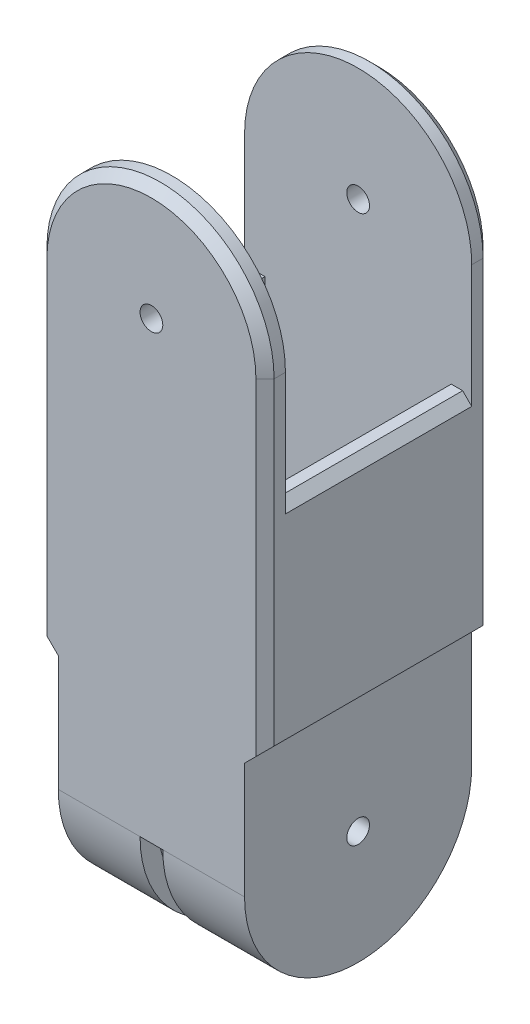
ISO-10303-21;
HEADER;
FILE_DESCRIPTION(('STEP AP214'),'2;1');
FILE_NAME('part.step','',(''),(''),'','','');
FILE_SCHEMA(('AUTOMOTIVE_DESIGN { 1 0 10303 214 1 1 1 1 }'));
ENDSEC;
DATA;
#1=APPLICATION_CONTEXT('core data for automotive mechanical design processes');
#2=APPLICATION_PROTOCOL_DEFINITION('international standard','automotive_design',2000,#1);
#3=PRODUCT_CONTEXT('',#1,'mechanical');
#4=PRODUCT('Part','Part','',(#3));
#5=PRODUCT_RELATED_PRODUCT_CATEGORY('part','',(#4));
#6=PRODUCT_DEFINITION_FORMATION('','',#4);
#7=PRODUCT_DEFINITION_CONTEXT('part definition',#1,'design');
#8=PRODUCT_DEFINITION('design','',#6,#7);
#9=PRODUCT_DEFINITION_SHAPE('','',#8);
#10=(LENGTH_UNIT() NAMED_UNIT(*) SI_UNIT(.MILLI.,.METRE.));
#11=(NAMED_UNIT(*) PLANE_ANGLE_UNIT() SI_UNIT($,.RADIAN.));
#12=(NAMED_UNIT(*) SI_UNIT($,.STERADIAN.) SOLID_ANGLE_UNIT());
#13=UNCERTAINTY_MEASURE_WITH_UNIT(LENGTH_MEASURE(1.E-05),#10,'distance_accuracy_value','');
#14=(GEOMETRIC_REPRESENTATION_CONTEXT(3) GLOBAL_UNCERTAINTY_ASSIGNED_CONTEXT((#13)) GLOBAL_UNIT_ASSIGNED_CONTEXT((#10,
#11,#12)) REPRESENTATION_CONTEXT('',''));
#15=CARTESIAN_POINT('',(0.,0.,0.));
#16=DIRECTION('',(0.,0.,1.));
#17=DIRECTION('',(1.,0.,0.));
#18=AXIS2_PLACEMENT_3D('',#15,#16,#17);
#19=CARTESIAN_POINT('',(-25.,25.,0.));
#20=DIRECTION('',(1.,0.,0.));
#21=DIRECTION('',(0.,0.,-1.));
#22=AXIS2_PLACEMENT_3D('',#19,#20,#21);
#23=CYLINDRICAL_SURFACE('',#22,25.);
#24=CARTESIAN_POINT('',(-2.5,25.,0.));
#25=DIRECTION('',(1.,0.,0.));
#26=DIRECTION('',(0.,0.,-1.));
#27=AXIS2_PLACEMENT_3D('',#24,#25,#26);
#28=CIRCLE('',#27,25.);
#29=CARTESIAN_POINT('',(-2.5,25.,25.));
#30=VERTEX_POINT('',#29);
#31=CARTESIAN_POINT('',(-2.5,25.,-25.));
#32=VERTEX_POINT('',#31);
#33=EDGE_CURVE('E730',#30,#32,#28,.T.);
#34=ORIENTED_EDGE('',*,*,#33,.F.);
#35=DIRECTION('',(1.,0.,0.));
#36=VECTOR('',#35,1.);
#37=CARTESIAN_POINT('',(-25.,25.,25.));
#38=LINE('',#37,#36);
#39=CARTESIAN_POINT('',(-20.5,25.,25.));
#40=VERTEX_POINT('',#39);
#41=EDGE_CURVE('E433',#40,#30,#38,.T.);
#42=ORIENTED_EDGE('',*,*,#41,.F.);
#43=CARTESIAN_POINT('',(-20.5,25.,0.));
#44=DIRECTION('',(1.,0.,0.));
#45=DIRECTION('',(0.,0.,-1.));
#46=AXIS2_PLACEMENT_3D('',#43,#44,#45);
#47=CIRCLE('',#46,25.);
#48=CARTESIAN_POINT('',(-20.5,25.,-25.));
#49=VERTEX_POINT('',#48);
#50=EDGE_CURVE('E412',#40,#49,#47,.T.);
#51=ORIENTED_EDGE('',*,*,#50,.T.);
#52=DIRECTION('',(1.,0.,0.));
#53=VECTOR('',#52,1.);
#54=CARTESIAN_POINT('',(-25.,25.,-25.));
#55=LINE('',#54,#53);
#56=EDGE_CURVE('E428',#49,#32,#55,.T.);
#57=ORIENTED_EDGE('',*,*,#56,.T.);
#58=EDGE_LOOP('',(#34,#42,#51,#57));
#59=FACE_BOUND('',#58,.T.);
#60=ADVANCED_FACE('F88',(#59),#23,.T.);
#61=CARTESIAN_POINT('',(2.5,25.,0.));
#62=DIRECTION('',(-1.,0.,0.));
#63=DIRECTION('',(0.,0.,1.));
#64=AXIS2_PLACEMENT_3D('',#61,#62,#63);
#65=CIRCLE('',#64,25.);
#66=CARTESIAN_POINT('',(2.5,25.,-25.));
#67=VERTEX_POINT('',#66);
#68=CARTESIAN_POINT('',(2.5,25.,25.));
#69=VERTEX_POINT('',#68);
#70=EDGE_CURVE('E105',#67,#69,#65,.T.);
#71=ORIENTED_EDGE('',*,*,#70,.F.);
#72=CARTESIAN_POINT('',(20.5,25.,-25.));
#73=VERTEX_POINT('',#72);
#74=EDGE_CURVE('E427',#67,#73,#55,.T.);
#75=ORIENTED_EDGE('',*,*,#74,.T.);
#76=CARTESIAN_POINT('',(20.5,25.,0.));
#77=DIRECTION('',(-1.,0.,0.));
#78=DIRECTION('',(0.,0.,1.));
#79=AXIS2_PLACEMENT_3D('',#76,#77,#78);
#80=CIRCLE('',#79,25.);
#81=CARTESIAN_POINT('',(20.5,25.,25.));
#82=VERTEX_POINT('',#81);
#83=EDGE_CURVE('E423',#73,#82,#80,.T.);
#84=ORIENTED_EDGE('',*,*,#83,.T.);
#85=EDGE_CURVE('E432',#69,#82,#38,.T.);
#86=ORIENTED_EDGE('',*,*,#85,.F.);
#87=EDGE_LOOP('',(#71,#75,#84,#86));
#88=FACE_BOUND('',#87,.T.);
#89=ADVANCED_FACE('F812',(#88),#23,.T.);
#90=CARTESIAN_POINT('',(-63.9574275274956,25.,0.));
#91=DIRECTION('',(1.,0.,0.));
#92=DIRECTION('',(0.,0.,-1.));
#93=AXIS2_PLACEMENT_3D('',#90,#91,#92);
#94=CYLINDRICAL_SURFACE('',#93,21.);
#95=DIRECTION('',(1.,0.,0.));
#96=VECTOR('',#95,1.);
#97=CARTESIAN_POINT('',(-63.9574275274956,25.,21.));
#98=LINE('',#97,#96);
#99=CARTESIAN_POINT('',(-17.,25.,21.));
#100=VERTEX_POINT('',#99);
#101=CARTESIAN_POINT('',(-2.5,25.,21.));
#102=VERTEX_POINT('',#101);
#103=EDGE_CURVE('E321',#100,#102,#98,.T.);
#104=ORIENTED_EDGE('',*,*,#103,.T.);
#105=CARTESIAN_POINT('',(-2.5,25.,0.));
#106=DIRECTION('',(1.,0.,0.));
#107=DIRECTION('',(0.,0.,-1.));
#108=AXIS2_PLACEMENT_3D('',#105,#106,#107);
#109=CIRCLE('',#108,21.);
#110=CARTESIAN_POINT('',(-2.5,25.,-21.));
#111=VERTEX_POINT('',#110);
#112=EDGE_CURVE('E733',#102,#111,#109,.T.);
#113=ORIENTED_EDGE('',*,*,#112,.T.);
#114=DIRECTION('',(1.,0.,0.));
#115=VECTOR('',#114,1.);
#116=CARTESIAN_POINT('',(-63.9574275274956,25.,-21.));
#117=LINE('',#116,#115);
#118=CARTESIAN_POINT('',(-17.,25.,-21.));
#119=VERTEX_POINT('',#118);
#120=EDGE_CURVE('E328',#119,#111,#117,.T.);
#121=ORIENTED_EDGE('',*,*,#120,.F.);
#122=CARTESIAN_POINT('',(-17.,25.,0.));
#123=DIRECTION('',(-1.,0.,0.));
#124=DIRECTION('',(0.,0.,1.));
#125=AXIS2_PLACEMENT_3D('',#122,#123,#124);
#126=CIRCLE('',#125,21.);
#127=EDGE_CURVE('E349',#119,#100,#126,.T.);
#128=ORIENTED_EDGE('',*,*,#127,.T.);
#129=EDGE_LOOP('',(#104,#113,#121,#128));
#130=FACE_BOUND('',#129,.T.);
#131=ADVANCED_FACE('F750',(#130),#94,.F.);
#132=CARTESIAN_POINT('',(2.5,25.,-21.));
#133=VERTEX_POINT('',#132);
#134=CARTESIAN_POINT('',(17.,25.,-21.));
#135=VERTEX_POINT('',#134);
#136=EDGE_CURVE('E313',#133,#135,#117,.T.);
#137=ORIENTED_EDGE('',*,*,#136,.F.);
#138=CARTESIAN_POINT('',(2.5,25.,0.));
#139=DIRECTION('',(-1.,0.,0.));
#140=DIRECTION('',(0.,0.,1.));
#141=AXIS2_PLACEMENT_3D('',#138,#139,#140);
#142=CIRCLE('',#141,21.);
#143=CARTESIAN_POINT('',(2.5,25.,21.));
#144=VERTEX_POINT('',#143);
#145=EDGE_CURVE('E300',#133,#144,#142,.T.);
#146=ORIENTED_EDGE('',*,*,#145,.T.);
#147=CARTESIAN_POINT('',(17.,25.,21.));
#148=VERTEX_POINT('',#147);
#149=EDGE_CURVE('E311',#144,#148,#98,.T.);
#150=ORIENTED_EDGE('',*,*,#149,.T.);
#151=CARTESIAN_POINT('',(17.,25.,0.));
#152=DIRECTION('',(-1.,0.,0.));
#153=DIRECTION('',(0.,0.,-1.));
#154=AXIS2_PLACEMENT_3D('',#151,#152,#153);
#155=CIRCLE('',#154,21.);
#156=EDGE_CURVE('E322',#135,#148,#155,.T.);
#157=ORIENTED_EDGE('',*,*,#156,.F.);
#158=EDGE_LOOP('',(#137,#146,#150,#157));
#159=FACE_BOUND('',#158,.T.);
#160=ADVANCED_FACE('F309',(#159),#94,.F.);
#161=CARTESIAN_POINT('',(-25.,25.,0.));
#162=DIRECTION('',(1.,0.,0.));
#163=DIRECTION('',(0.,0.,-1.));
#164=AXIS2_PLACEMENT_3D('',#161,#162,#163);
#165=CYLINDRICAL_SURFACE('',#164,2.5);
#166=CARTESIAN_POINT('',(17.,25.,0.));
#167=DIRECTION('',(1.,0.,0.));
#168=DIRECTION('',(0.,0.,-1.));
#169=AXIS2_PLACEMENT_3D('',#166,#167,#168);
#170=CIRCLE('',#169,2.5);
#171=CARTESIAN_POINT('',(17.,25.,-2.5));
#172=VERTEX_POINT('',#171);
#173=EDGE_CURVE('E12',#172,#172,#170,.T.);
#174=ORIENTED_EDGE('',*,*,#173,.F.);
#175=EDGE_LOOP('',(#174));
#176=FACE_BOUND('',#175,.T.);
#177=CARTESIAN_POINT('',(20.5,25.,0.));
#178=DIRECTION('',(-1.,0.,0.));
#179=DIRECTION('',(0.,0.,1.));
#180=AXIS2_PLACEMENT_3D('',#177,#178,#179);
#181=CIRCLE('',#180,2.5);
#182=CARTESIAN_POINT('',(20.5,25.,2.5));
#183=VERTEX_POINT('',#182);
#184=EDGE_CURVE('E422',#183,#183,#181,.T.);
#185=ORIENTED_EDGE('',*,*,#184,.F.);
#186=EDGE_LOOP('',(#185));
#187=FACE_BOUND('',#186,.T.);
#188=ADVANCED_FACE('F644',(#176,#187),#165,.F.);
#189=CARTESIAN_POINT('',(0.,55.0000000000001,0.));
#190=DIRECTION('',(0.,-1.,0.));
#191=DIRECTION('',(0.,0.,-1.));
#192=AXIS2_PLACEMENT_3D('',#189,#190,#191);
#193=PLANE('',#192);
#194=DIRECTION('',(0.,0.,-1.));
#195=VECTOR('',#194,1.);
#196=CARTESIAN_POINT('',(17.,55.0000000000001,20.5));
#197=LINE('',#196,#195);
#198=CARTESIAN_POINT('',(17.,55.0000000000001,20.5));
#199=VERTEX_POINT('',#198);
#200=CARTESIAN_POINT('',(17.,55.0000000000001,-20.5));
#201=VERTEX_POINT('',#200);
#202=EDGE_CURVE('E345',#199,#201,#197,.T.);
#203=ORIENTED_EDGE('',*,*,#202,.F.);
#204=DIRECTION('',(1.,0.,0.));
#205=VECTOR('',#204,1.);
#206=CARTESIAN_POINT('',(-20.5,55.0000000000001,20.5));
#207=LINE('',#206,#205);
#208=CARTESIAN_POINT('',(20.5,55.0000000000001,20.5));
#209=VERTEX_POINT('',#208);
#210=EDGE_CURVE('E379',#199,#209,#207,.T.);
#211=ORIENTED_EDGE('',*,*,#210,.T.);
#212=DIRECTION('',(0.,0.,-1.));
#213=VECTOR('',#212,1.);
#214=CARTESIAN_POINT('',(20.5,55.0000000000001,20.5));
#215=LINE('',#214,#213);
#216=CARTESIAN_POINT('',(20.5,55.0000000000001,-20.5));
#217=VERTEX_POINT('',#216);
#218=EDGE_CURVE('E365',#209,#217,#215,.T.);
#219=ORIENTED_EDGE('',*,*,#218,.T.);
#220=DIRECTION('',(-1.,0.,0.));
#221=VECTOR('',#220,1.);
#222=CARTESIAN_POINT('',(-20.5,55.0000000000001,-20.5));
#223=LINE('',#222,#221);
#224=EDGE_CURVE('E371',#217,#201,#223,.T.);
#225=ORIENTED_EDGE('',*,*,#224,.T.);
#226=EDGE_LOOP('',(#203,#211,#219,#225));
#227=FACE_BOUND('',#226,.T.);
#228=ADVANCED_FACE('F779',(#227),#193,.F.);
#229=DIRECTION('',(0.,0.,1.));
#230=VECTOR('',#229,1.);
#231=CARTESIAN_POINT('',(-17.,55.0000000000001,20.5));
#232=LINE('',#231,#230);
#233=CARTESIAN_POINT('',(-17.,55.0000000000001,-20.5));
#234=VERTEX_POINT('',#233);
#235=CARTESIAN_POINT('',(-17.,55.0000000000001,20.5));
#236=VERTEX_POINT('',#235);
#237=EDGE_CURVE('E341',#234,#236,#232,.T.);
#238=ORIENTED_EDGE('',*,*,#237,.F.);
#239=CARTESIAN_POINT('',(-20.5,55.0000000000001,-20.5));
#240=VERTEX_POINT('',#239);
#241=EDGE_CURVE('E369',#234,#240,#223,.T.);
#242=ORIENTED_EDGE('',*,*,#241,.T.);
#243=DIRECTION('',(0.,0.,1.));
#244=VECTOR('',#243,1.);
#245=CARTESIAN_POINT('',(-20.5,55.0000000000001,20.5));
#246=LINE('',#245,#244);
#247=CARTESIAN_POINT('',(-20.5,55.0000000000001,20.5));
#248=VERTEX_POINT('',#247);
#249=EDGE_CURVE('E375',#240,#248,#246,.T.);
#250=ORIENTED_EDGE('',*,*,#249,.T.);
#251=EDGE_CURVE('E380',#248,#236,#207,.T.);
#252=ORIENTED_EDGE('',*,*,#251,.T.);
#253=EDGE_LOOP('',(#238,#242,#250,#252));
#254=FACE_BOUND('',#253,.T.);
#255=ADVANCED_FACE('F766',(#254),#193,.F.);
#256=CARTESIAN_POINT('',(0.,100.,0.));
#257=DIRECTION('',(0.,-1.,0.));
#258=DIRECTION('',(0.,0.,-1.));
#259=AXIS2_PLACEMENT_3D('',#256,#257,#258);
#260=PLANE('',#259);
#261=DIRECTION('',(-1.,0.,0.));
#262=VECTOR('',#261,1.);
#263=CARTESIAN_POINT('',(25.,100.,-20.5));
#264=LINE('',#263,#262);
#265=CARTESIAN_POINT('',(23.,100.,-20.5));
#266=VERTEX_POINT('',#265);
#267=CARTESIAN_POINT('',(20.5,100.,-20.5));
#268=VERTEX_POINT('',#267);
#269=EDGE_CURVE('E479',#266,#268,#264,.T.);
#270=ORIENTED_EDGE('',*,*,#269,.T.);
#271=DIRECTION('',(0.,0.,-1.));
#272=VECTOR('',#271,1.);
#273=CARTESIAN_POINT('',(20.5,100.,20.5));
#274=LINE('',#273,#272);
#275=CARTESIAN_POINT('',(20.5,100.,20.5));
#276=VERTEX_POINT('',#275);
#277=EDGE_CURVE('E356',#276,#268,#274,.T.);
#278=ORIENTED_EDGE('',*,*,#277,.F.);
#279=DIRECTION('',(-1.,0.,0.));
#280=VECTOR('',#279,1.);
#281=CARTESIAN_POINT('',(25.,100.,20.5));
#282=LINE('',#281,#280);
#283=CARTESIAN_POINT('',(23.,100.,20.5));
#284=VERTEX_POINT('',#283);
#285=EDGE_CURVE('E455',#284,#276,#282,.T.);
#286=ORIENTED_EDGE('',*,*,#285,.F.);
#287=DIRECTION('',(0.,0.,-1.));
#288=VECTOR('',#287,1.);
#289=CARTESIAN_POINT('',(23.,100.,0.));
#290=LINE('',#289,#288);
#291=EDGE_CURVE('E509',#284,#266,#290,.T.);
#292=ORIENTED_EDGE('',*,*,#291,.T.);
#293=EDGE_LOOP('',(#270,#278,#286,#292));
#294=FACE_BOUND('',#293,.T.);
#295=ADVANCED_FACE('F790',(#294),#260,.F.);
#296=CARTESIAN_POINT('',(-25.,100.,25.));
#297=DIRECTION('',(1.,0.,0.));
#298=DIRECTION('',(0.,0.,-1.));
#299=AXIS2_PLACEMENT_3D('',#296,#297,#298);
#300=PLANE('',#299);
#301=DIRECTION('',(0.,-1.,0.));
#302=VECTOR('',#301,1.);
#303=CARTESIAN_POINT('',(-25.,100.,-23.));
#304=LINE('',#303,#302);
#305=CARTESIAN_POINT('',(-25.,125.,-23.));
#306=VERTEX_POINT('',#305);
#307=CARTESIAN_POINT('',(-25.,55.0000000000001,-23.));
#308=VERTEX_POINT('',#307);
#309=EDGE_CURVE('E527',#306,#308,#304,.T.);
#310=ORIENTED_EDGE('',*,*,#309,.T.);
#311=DIRECTION('',(0.,0.,1.));
#312=VECTOR('',#311,1.);
#313=CARTESIAN_POINT('',(-25.,55.0000000000001,23.));
#314=LINE('',#313,#312);
#315=CARTESIAN_POINT('',(-25.,55.0000000000001,23.));
#316=VERTEX_POINT('',#315);
#317=EDGE_CURVE('E614',#308,#316,#314,.T.);
#318=ORIENTED_EDGE('',*,*,#317,.T.);
#319=DIRECTION('',(0.,1.,0.));
#320=VECTOR('',#319,1.);
#321=CARTESIAN_POINT('',(-25.,100.,23.));
#322=LINE('',#321,#320);
#323=CARTESIAN_POINT('',(-25.,125.,23.));
#324=VERTEX_POINT('',#323);
#325=EDGE_CURVE('E524',#316,#324,#322,.T.);
#326=ORIENTED_EDGE('',*,*,#325,.T.);
#327=DIRECTION('',(0.,0.,1.));
#328=VECTOR('',#327,1.);
#329=CARTESIAN_POINT('',(-25.,125.,20.5));
#330=LINE('',#329,#328);
#331=CARTESIAN_POINT('',(-25.,125.,20.5));
#332=VERTEX_POINT('',#331);
#333=EDGE_CURVE('E460',#332,#324,#330,.T.);
#334=ORIENTED_EDGE('',*,*,#333,.F.);
#335=DIRECTION('',(0.,1.,0.));
#336=VECTOR('',#335,1.);
#337=CARTESIAN_POINT('',(-25.,100.,20.5));
#338=LINE('',#337,#336);
#339=CARTESIAN_POINT('',(-25.,98.,20.5));
#340=VERTEX_POINT('',#339);
#341=EDGE_CURVE('E451',#340,#332,#338,.T.);
#342=ORIENTED_EDGE('',*,*,#341,.F.);
#343=DIRECTION('',(0.,0.,-1.));
#344=VECTOR('',#343,1.);
#345=CARTESIAN_POINT('',(-25.,98.,25.));
#346=LINE('',#345,#344);
#347=CARTESIAN_POINT('',(-25.,98.,-20.5));
#348=VERTEX_POINT('',#347);
#349=EDGE_CURVE('E531',#340,#348,#346,.T.);
#350=ORIENTED_EDGE('',*,*,#349,.T.);
#351=DIRECTION('',(0.,1.,0.));
#352=VECTOR('',#351,1.);
#353=CARTESIAN_POINT('',(-25.,100.,-20.5));
#354=LINE('',#353,#352);
#355=CARTESIAN_POINT('',(-25.,125.,-20.5));
#356=VERTEX_POINT('',#355);
#357=EDGE_CURVE('E483',#348,#356,#354,.T.);
#358=ORIENTED_EDGE('',*,*,#357,.T.);
#359=DIRECTION('',(0.,0.,-1.));
#360=VECTOR('',#359,1.);
#361=CARTESIAN_POINT('',(-25.,125.,-20.5));
#362=LINE('',#361,#360);
#363=EDGE_CURVE('E491',#356,#306,#362,.T.);
#364=ORIENTED_EDGE('',*,*,#363,.T.);
#365=EDGE_LOOP('',(#310,#318,#326,#334,#342,#350,#358,#364));
#366=FACE_BOUND('',#365,.T.);
#367=ADVANCED_FACE('F798',(#366),#300,.F.);
#368=CARTESIAN_POINT('',(-25.,100.,25.));
#369=DIRECTION('',(0.,0.,-1.));
#370=DIRECTION('',(-1.,0.,0.));
#371=AXIS2_PLACEMENT_3D('',#368,#369,#370);
#372=PLANE('',#371);
#373=CARTESIAN_POINT('',(0.,125.,25.));
#374=DIRECTION('',(0.,0.,-1.));
#375=DIRECTION('',(-1.,0.,0.));
#376=AXIS2_PLACEMENT_3D('',#373,#374,#375);
#377=CIRCLE('',#376,2.5);
#378=CARTESIAN_POINT('',(-2.5,125.,25.));
#379=VERTEX_POINT('',#378);
#380=EDGE_CURVE('E437',#379,#379,#377,.T.);
#381=ORIENTED_EDGE('',*,*,#380,.T.);
#382=EDGE_LOOP('',(#381));
#383=FACE_BOUND('',#382,.T.);
#384=DIRECTION('',(0.,-1.,0.));
#385=VECTOR('',#384,1.);
#386=CARTESIAN_POINT('',(20.5,0.,25.));
#387=LINE('',#386,#385);
#388=CARTESIAN_POINT('',(20.5,50.5000000000001,25.));
#389=VERTEX_POINT('',#388);
#390=EDGE_CURVE('E415',#389,#82,#387,.T.);
#391=ORIENTED_EDGE('',*,*,#390,.F.);
#392=DIRECTION('',(-0.707106781186551,-0.707106781186544,0.));
#393=VECTOR('',#392,1.);
#394=CARTESIAN_POINT('',(19.9999999999999,50.,25.));
#395=LINE('',#394,#393);
#396=CARTESIAN_POINT('',(23.,53.0000000000001,25.));
#397=VERTEX_POINT('',#396);
#398=EDGE_CURVE('E594',#389,#397,#395,.F.);
#399=ORIENTED_EDGE('',*,*,#398,.T.);
#400=DIRECTION('',(0.,1.,0.));
#401=VECTOR('',#400,1.);
#402=CARTESIAN_POINT('',(23.,100.,25.));
#403=LINE('',#402,#401);
#404=CARTESIAN_POINT('',(23.,125.,25.));
#405=VERTEX_POINT('',#404);
#406=EDGE_CURVE('E551',#397,#405,#403,.T.);
#407=ORIENTED_EDGE('',*,*,#406,.T.);
#408=CARTESIAN_POINT('',(0.,125.,25.));
#409=DIRECTION('',(0.,0.,-1.));
#410=DIRECTION('',(-1.,0.,0.));
#411=AXIS2_PLACEMENT_3D('',#408,#409,#410);
#412=CIRCLE('',#411,23.);
#413=CARTESIAN_POINT('',(-23.,125.,25.));
#414=VERTEX_POINT('',#413);
#415=EDGE_CURVE('E548',#405,#414,#412,.F.);
#416=ORIENTED_EDGE('',*,*,#415,.T.);
#417=DIRECTION('',(0.,-1.,0.));
#418=VECTOR('',#417,1.);
#419=CARTESIAN_POINT('',(-23.,100.,25.));
#420=LINE('',#419,#418);
#421=CARTESIAN_POINT('',(-23.,53.0000000000001,25.));
#422=VERTEX_POINT('',#421);
#423=EDGE_CURVE('E554',#414,#422,#420,.T.);
#424=ORIENTED_EDGE('',*,*,#423,.T.);
#425=DIRECTION('',(0.707106781186544,-0.707106781186551,0.));
#426=VECTOR('',#425,1.);
#427=CARTESIAN_POINT('',(-25.,55.0000000000001,25.));
#428=LINE('',#427,#426);
#429=CARTESIAN_POINT('',(-20.5,50.5000000000001,25.));
#430=VERTEX_POINT('',#429);
#431=EDGE_CURVE('E576',#422,#430,#428,.T.);
#432=ORIENTED_EDGE('',*,*,#431,.T.);
#433=DIRECTION('',(0.,-1.,0.));
#434=VECTOR('',#433,1.);
#435=CARTESIAN_POINT('',(-20.5,0.,25.));
#436=LINE('',#435,#434);
#437=EDGE_CURVE('E403',#430,#40,#436,.T.);
#438=ORIENTED_EDGE('',*,*,#437,.T.);
#439=ORIENTED_EDGE('',*,*,#41,.T.);
#440=DIRECTION('',(1.,0.,0.));
#441=VECTOR('',#440,1.);
#442=CARTESIAN_POINT('',(-25.,25.,25.));
#443=LINE('',#442,#441);
#444=EDGE_CURVE('E727',#69,#30,#443,.F.);
#445=ORIENTED_EDGE('',*,*,#444,.F.);
#446=ORIENTED_EDGE('',*,*,#85,.T.);
#447=EDGE_LOOP('',(#391,#399,#407,#416,#424,#432,#438,#439,#445,#446));
#448=FACE_BOUND('',#447,.T.);
#449=ADVANCED_FACE('F658',(#383,#448),#372,.F.);
#450=CARTESIAN_POINT('',(-25.,100.,-25.));
#451=DIRECTION('',(0.,0.,1.));
#452=DIRECTION('',(1.,0.,0.));
#453=AXIS2_PLACEMENT_3D('',#450,#451,#452);
#454=PLANE('',#453);
#455=DIRECTION('',(0.707106781186551,0.707106781186544,0.));
#456=VECTOR('',#455,1.);
#457=CARTESIAN_POINT('',(19.9999999999999,50.,-25.));
#458=LINE('',#457,#456);
#459=CARTESIAN_POINT('',(23.,53.0000000000001,-25.));
#460=VERTEX_POINT('',#459);
#461=CARTESIAN_POINT('',(20.5,50.5000000000001,-25.));
#462=VERTEX_POINT('',#461);
#463=EDGE_CURVE('E607',#460,#462,#458,.F.);
#464=ORIENTED_EDGE('',*,*,#463,.T.);
#465=DIRECTION('',(0.,1.,0.));
#466=VECTOR('',#465,1.);
#467=CARTESIAN_POINT('',(20.5,50.,-25.));
#468=LINE('',#467,#466);
#469=EDGE_CURVE('E419',#73,#462,#468,.T.);
#470=ORIENTED_EDGE('',*,*,#469,.F.);
#471=ORIENTED_EDGE('',*,*,#74,.F.);
#472=DIRECTION('',(1.,0.,0.));
#473=VECTOR('',#472,1.);
#474=CARTESIAN_POINT('',(-25.,25.,-25.));
#475=LINE('',#474,#473);
#476=EDGE_CURVE('E707',#32,#67,#475,.T.);
#477=ORIENTED_EDGE('',*,*,#476,.F.);
#478=ORIENTED_EDGE('',*,*,#56,.F.);
#479=DIRECTION('',(0.,1.,0.));
#480=VECTOR('',#479,1.);
#481=CARTESIAN_POINT('',(-20.5,50.,-25.));
#482=LINE('',#481,#480);
#483=CARTESIAN_POINT('',(-20.5,50.5000000000001,-25.));
#484=VERTEX_POINT('',#483);
#485=EDGE_CURVE('E407',#49,#484,#482,.T.);
#486=ORIENTED_EDGE('',*,*,#485,.T.);
#487=DIRECTION('',(-0.707106781186544,0.707106781186551,0.));
#488=VECTOR('',#487,1.);
#489=CARTESIAN_POINT('',(-25.,55.0000000000001,-25.));
#490=LINE('',#489,#488);
#491=CARTESIAN_POINT('',(-23.,53.0000000000001,-25.));
#492=VERTEX_POINT('',#491);
#493=EDGE_CURVE('E604',#484,#492,#490,.T.);
#494=ORIENTED_EDGE('',*,*,#493,.T.);
#495=DIRECTION('',(0.,1.,0.));
#496=VECTOR('',#495,1.);
#497=CARTESIAN_POINT('',(-23.,100.,-25.));
#498=LINE('',#497,#496);
#499=CARTESIAN_POINT('',(-23.,125.,-25.));
#500=VERTEX_POINT('',#499);
#501=EDGE_CURVE('E542',#492,#500,#498,.T.);
#502=ORIENTED_EDGE('',*,*,#501,.T.);
#503=CARTESIAN_POINT('',(0.,125.,-25.));
#504=DIRECTION('',(0.,0.,1.));
#505=DIRECTION('',(1.,0.,0.));
#506=AXIS2_PLACEMENT_3D('',#503,#504,#505);
#507=CIRCLE('',#506,23.);
#508=CARTESIAN_POINT('',(23.,125.,-25.));
#509=VERTEX_POINT('',#508);
#510=EDGE_CURVE('E535',#500,#509,#507,.F.);
#511=ORIENTED_EDGE('',*,*,#510,.T.);
#512=DIRECTION('',(0.,-1.,0.));
#513=VECTOR('',#512,1.);
#514=CARTESIAN_POINT('',(23.,100.,-25.));
#515=LINE('',#514,#513);
#516=EDGE_CURVE('E538',#509,#460,#515,.T.);
#517=ORIENTED_EDGE('',*,*,#516,.T.);
#518=EDGE_LOOP('',(#464,#470,#471,#477,#478,#486,#494,#502,#511,#517));
#519=FACE_BOUND('',#518,.T.);
#520=CARTESIAN_POINT('',(0.,125.,-25.));
#521=DIRECTION('',(0.,0.,-1.));
#522=DIRECTION('',(-1.,0.,0.));
#523=AXIS2_PLACEMENT_3D('',#520,#521,#522);
#524=CIRCLE('',#523,2.5);
#525=CARTESIAN_POINT('',(-2.5,125.,-25.));
#526=VERTEX_POINT('',#525);
#527=EDGE_CURVE('E464',#526,#526,#524,.T.);
#528=ORIENTED_EDGE('',*,*,#527,.F.);
#529=EDGE_LOOP('',(#528));
#530=FACE_BOUND('',#529,.T.);
#531=ADVANCED_FACE('F665',(#519,#530),#454,.F.);
#532=CARTESIAN_POINT('',(25.,100.,25.));
#533=DIRECTION('',(-1.,0.,0.));
#534=DIRECTION('',(0.,0.,1.));
#535=AXIS2_PLACEMENT_3D('',#532,#533,#534);
#536=PLANE('',#535);
#537=DIRECTION('',(0.,-1.,0.));
#538=VECTOR('',#537,1.);
#539=CARTESIAN_POINT('',(25.,100.,23.));
#540=LINE('',#539,#538);
#541=CARTESIAN_POINT('',(25.,125.,23.));
#542=VERTEX_POINT('',#541);
#543=CARTESIAN_POINT('',(25.,55.0000000000001,23.));
#544=VERTEX_POINT('',#543);
#545=EDGE_CURVE('E513',#542,#544,#540,.T.);
#546=ORIENTED_EDGE('',*,*,#545,.T.);
#547=DIRECTION('',(0.,0.,-1.));
#548=VECTOR('',#547,1.);
#549=CARTESIAN_POINT('',(25.,55.0000000000001,25.));
#550=LINE('',#549,#548);
#551=CARTESIAN_POINT('',(25.,55.0000000000001,-23.));
#552=VERTEX_POINT('',#551);
#553=EDGE_CURVE('E600',#544,#552,#550,.T.);
#554=ORIENTED_EDGE('',*,*,#553,.T.);
#555=DIRECTION('',(0.,1.,0.));
#556=VECTOR('',#555,1.);
#557=CARTESIAN_POINT('',(25.,100.,-23.));
#558=LINE('',#557,#556);
#559=CARTESIAN_POINT('',(25.,125.,-23.));
#560=VERTEX_POINT('',#559);
#561=EDGE_CURVE('E517',#552,#560,#558,.T.);
#562=ORIENTED_EDGE('',*,*,#561,.T.);
#563=DIRECTION('',(0.,0.,-1.));
#564=VECTOR('',#563,1.);
#565=CARTESIAN_POINT('',(25.,125.,-20.5));
#566=LINE('',#565,#564);
#567=CARTESIAN_POINT('',(25.,125.,-20.5));
#568=VERTEX_POINT('',#567);
#569=EDGE_CURVE('E492',#568,#560,#566,.T.);
#570=ORIENTED_EDGE('',*,*,#569,.F.);
#571=DIRECTION('',(0.,-1.,0.));
#572=VECTOR('',#571,1.);
#573=CARTESIAN_POINT('',(25.,100.,-20.5));
#574=LINE('',#573,#572);
#575=CARTESIAN_POINT('',(25.,98.,-20.5));
#576=VERTEX_POINT('',#575);
#577=EDGE_CURVE('E472',#568,#576,#574,.T.);
#578=ORIENTED_EDGE('',*,*,#577,.T.);
#579=DIRECTION('',(0.,0.,1.));
#580=VECTOR('',#579,1.);
#581=CARTESIAN_POINT('',(25.,98.,25.));
#582=LINE('',#581,#580);
#583=CARTESIAN_POINT('',(25.,98.,20.5));
#584=VERTEX_POINT('',#583);
#585=EDGE_CURVE('E520',#576,#584,#582,.T.);
#586=ORIENTED_EDGE('',*,*,#585,.T.);
#587=DIRECTION('',(0.,-1.,0.));
#588=VECTOR('',#587,1.);
#589=CARTESIAN_POINT('',(25.,100.,20.5));
#590=LINE('',#589,#588);
#591=CARTESIAN_POINT('',(25.,125.,20.5));
#592=VERTEX_POINT('',#591);
#593=EDGE_CURVE('E442',#592,#584,#590,.T.);
#594=ORIENTED_EDGE('',*,*,#593,.F.);
#595=DIRECTION('',(0.,0.,1.));
#596=VECTOR('',#595,1.);
#597=CARTESIAN_POINT('',(25.,125.,20.5));
#598=LINE('',#597,#596);
#599=EDGE_CURVE('E459',#592,#542,#598,.T.);
#600=ORIENTED_EDGE('',*,*,#599,.T.);
#601=EDGE_LOOP('',(#546,#554,#562,#570,#578,#586,#594,#600));
#602=FACE_BOUND('',#601,.T.);
#603=ADVANCED_FACE('F688',(#602),#536,.F.);
#604=CARTESIAN_POINT('',(-20.5,100.,20.5));
#605=VERTEX_POINT('',#604);
#606=CARTESIAN_POINT('',(-23.,100.,20.5));
#607=VERTEX_POINT('',#606);
#608=EDGE_CURVE('E454',#605,#607,#282,.T.);
#609=ORIENTED_EDGE('',*,*,#608,.F.);
#610=DIRECTION('',(0.,0.,1.));
#611=VECTOR('',#610,1.);
#612=CARTESIAN_POINT('',(-20.5,100.,20.5));
#613=LINE('',#612,#611);
#614=CARTESIAN_POINT('',(-20.5,100.,-20.5));
#615=VERTEX_POINT('',#614);
#616=EDGE_CURVE('E370',#615,#605,#613,.T.);
#617=ORIENTED_EDGE('',*,*,#616,.F.);
#618=CARTESIAN_POINT('',(-23.,100.,-20.5));
#619=VERTEX_POINT('',#618);
#620=EDGE_CURVE('E478',#615,#619,#264,.T.);
#621=ORIENTED_EDGE('',*,*,#620,.T.);
#622=DIRECTION('',(0.,0.,1.));
#623=VECTOR('',#622,1.);
#624=CARTESIAN_POINT('',(-23.,100.,0.));
#625=LINE('',#624,#623);
#626=EDGE_CURVE('E496',#619,#607,#625,.T.);
#627=ORIENTED_EDGE('',*,*,#626,.T.);
#628=EDGE_LOOP('',(#609,#617,#621,#627));
#629=FACE_BOUND('',#628,.T.);
#630=ADVANCED_FACE('F807',(#629),#260,.F.);
#631=CARTESIAN_POINT('',(0.,125.,-20.5));
#632=DIRECTION('',(0.,0.,-1.));
#633=DIRECTION('',(-1.,0.,0.));
#634=AXIS2_PLACEMENT_3D('',#631,#632,#633);
#635=CYLINDRICAL_SURFACE('',#634,25.);
#636=ORIENTED_EDGE('',*,*,#569,.T.);
#637=CARTESIAN_POINT('',(0.,125.,-23.));
#638=DIRECTION('',(0.,0.,1.));
#639=DIRECTION('',(1.,0.,0.));
#640=AXIS2_PLACEMENT_3D('',#637,#638,#639);
#641=CIRCLE('',#640,25.);
#642=EDGE_CURVE('E545',#560,#306,#641,.T.);
#643=ORIENTED_EDGE('',*,*,#642,.T.);
#644=ORIENTED_EDGE('',*,*,#363,.F.);
#645=CARTESIAN_POINT('',(0.,125.,-20.5));
#646=DIRECTION('',(0.,0.,-1.));
#647=DIRECTION('',(1.,0.,0.));
#648=AXIS2_PLACEMENT_3D('',#645,#646,#647);
#649=CIRCLE('',#648,25.);
#650=EDGE_CURVE('E487',#356,#568,#649,.T.);
#651=ORIENTED_EDGE('',*,*,#650,.T.);
#652=EDGE_LOOP('',(#636,#643,#644,#651));
#653=FACE_BOUND('',#652,.T.);
#654=ADVANCED_FACE('F796',(#653),#635,.T.);
#655=CARTESIAN_POINT('',(0.,125.,-20.5));
#656=DIRECTION('',(0.,0.,1.));
#657=DIRECTION('',(1.,0.,0.));
#658=AXIS2_PLACEMENT_3D('',#655,#656,#657);
#659=PLANE('',#658);
#660=CARTESIAN_POINT('',(0.,125.,-20.5));
#661=DIRECTION('',(0.,0.,-1.));
#662=DIRECTION('',(-1.,0.,0.));
#663=AXIS2_PLACEMENT_3D('',#660,#661,#662);
#664=CIRCLE('',#663,2.5);
#665=CARTESIAN_POINT('',(-2.5,125.,-20.5));
#666=VERTEX_POINT('',#665);
#667=EDGE_CURVE('E468',#666,#666,#664,.T.);
#668=ORIENTED_EDGE('',*,*,#667,.T.);
#669=EDGE_LOOP('',(#668));
#670=FACE_BOUND('',#669,.T.);
#671=ORIENTED_EDGE('',*,*,#577,.F.);
#672=ORIENTED_EDGE('',*,*,#650,.F.);
#673=ORIENTED_EDGE('',*,*,#357,.F.);
#674=DIRECTION('',(-0.707106781186545,-0.70710678118655,0.));
#675=VECTOR('',#674,1.);
#676=CARTESIAN_POINT('',(-23.,100.,-20.5));
#677=LINE('',#676,#675);
#678=EDGE_CURVE('E572',#348,#619,#677,.F.);
#679=ORIENTED_EDGE('',*,*,#678,.T.);
#680=ORIENTED_EDGE('',*,*,#620,.F.);
#681=DIRECTION('',(0.,1.,0.));
#682=VECTOR('',#681,1.);
#683=CARTESIAN_POINT('',(-20.5,55.0000000000001,-20.5));
#684=LINE('',#683,#682);
#685=EDGE_CURVE('E398',#240,#615,#684,.T.);
#686=ORIENTED_EDGE('',*,*,#685,.F.);
#687=ORIENTED_EDGE('',*,*,#241,.F.);
#688=DIRECTION('',(0.,1.,0.));
#689=VECTOR('',#688,1.);
#690=CARTESIAN_POINT('',(-17.,25.,-20.5));
#691=LINE('',#690,#689);
#692=CARTESIAN_POINT('',(-17.,25.,-20.5));
#693=VERTEX_POINT('',#692);
#694=EDGE_CURVE('E360',#693,#234,#691,.T.);
#695=ORIENTED_EDGE('',*,*,#694,.F.);
#696=DIRECTION('',(-1.,0.,0.));
#697=VECTOR('',#696,1.);
#698=CARTESIAN_POINT('',(-17.,25.,-20.5));
#699=LINE('',#698,#697);
#700=CARTESIAN_POINT('',(17.,25.,-20.5));
#701=VERTEX_POINT('',#700);
#702=EDGE_CURVE('E337',#701,#693,#699,.T.);
#703=ORIENTED_EDGE('',*,*,#702,.F.);
#704=DIRECTION('',(0.,1.,0.));
#705=VECTOR('',#704,1.);
#706=CARTESIAN_POINT('',(17.,25.,-20.5));
#707=LINE('',#706,#705);
#708=EDGE_CURVE('E344',#701,#201,#707,.T.);
#709=ORIENTED_EDGE('',*,*,#708,.T.);
#710=ORIENTED_EDGE('',*,*,#224,.F.);
#711=DIRECTION('',(0.,1.,0.));
#712=VECTOR('',#711,1.);
#713=CARTESIAN_POINT('',(20.5,55.0000000000001,-20.5));
#714=LINE('',#713,#712);
#715=EDGE_CURVE('E384',#217,#268,#714,.T.);
#716=ORIENTED_EDGE('',*,*,#715,.T.);
#717=ORIENTED_EDGE('',*,*,#269,.F.);
#718=DIRECTION('',(-0.707106781186545,0.70710678118655,0.));
#719=VECTOR('',#718,1.);
#720=CARTESIAN_POINT('',(23.,100.,-20.5));
#721=LINE('',#720,#719);
#722=EDGE_CURVE('E561',#266,#576,#721,.F.);
#723=ORIENTED_EDGE('',*,*,#722,.T.);
#724=EDGE_LOOP('',(#671,#672,#673,#679,#680,#686,#687,#695,#703,#709,#710,#716,#717,#723));
#725=FACE_BOUND('',#724,.T.);
#726=ADVANCED_FACE('F761',(#670,#725),#659,.T.);
#727=CARTESIAN_POINT('',(0.,125.,-20.5));
#728=DIRECTION('',(0.,0.,-1.));
#729=DIRECTION('',(-1.,0.,0.));
#730=AXIS2_PLACEMENT_3D('',#727,#728,#729);
#731=CYLINDRICAL_SURFACE('',#730,2.5);
#732=ORIENTED_EDGE('',*,*,#667,.F.);
#733=EDGE_LOOP('',(#732));
#734=FACE_BOUND('',#733,.T.);
#735=ORIENTED_EDGE('',*,*,#527,.T.);
#736=EDGE_LOOP('',(#735));
#737=FACE_BOUND('',#736,.T.);
#738=ADVANCED_FACE('F830',(#734,#737),#731,.F.);
#739=CARTESIAN_POINT('',(0.,125.,20.5));
#740=DIRECTION('',(0.,0.,-1.));
#741=DIRECTION('',(1.,0.,0.));
#742=AXIS2_PLACEMENT_3D('',#739,#740,#741);
#743=PLANE('',#742);
#744=ORIENTED_EDGE('',*,*,#593,.T.);
#745=DIRECTION('',(0.707106781186545,-0.70710678118655,0.));
#746=VECTOR('',#745,1.);
#747=CARTESIAN_POINT('',(23.,100.,20.5));
#748=LINE('',#747,#746);
#749=EDGE_CURVE('E565',#584,#284,#748,.F.);
#750=ORIENTED_EDGE('',*,*,#749,.T.);
#751=ORIENTED_EDGE('',*,*,#285,.T.);
#752=DIRECTION('',(0.,1.,0.));
#753=VECTOR('',#752,1.);
#754=CARTESIAN_POINT('',(20.5,55.0000000000001,20.5));
#755=LINE('',#754,#753);
#756=EDGE_CURVE('E390',#209,#276,#755,.T.);
#757=ORIENTED_EDGE('',*,*,#756,.F.);
#758=ORIENTED_EDGE('',*,*,#210,.F.);
#759=DIRECTION('',(0.,1.,0.));
#760=VECTOR('',#759,1.);
#761=CARTESIAN_POINT('',(17.,25.,20.5));
#762=LINE('',#761,#760);
#763=CARTESIAN_POINT('',(17.,25.,20.5));
#764=VERTEX_POINT('',#763);
#765=EDGE_CURVE('E353',#764,#199,#762,.T.);
#766=ORIENTED_EDGE('',*,*,#765,.F.);
#767=DIRECTION('',(1.,0.,0.));
#768=VECTOR('',#767,1.);
#769=CARTESIAN_POINT('',(-17.,25.,20.5));
#770=LINE('',#769,#768);
#771=CARTESIAN_POINT('',(-17.,25.,20.5));
#772=VERTEX_POINT('',#771);
#773=EDGE_CURVE('E340',#772,#764,#770,.T.);
#774=ORIENTED_EDGE('',*,*,#773,.F.);
#775=DIRECTION('',(0.,1.,0.));
#776=VECTOR('',#775,1.);
#777=CARTESIAN_POINT('',(-17.,25.,20.5));
#778=LINE('',#777,#776);
#779=EDGE_CURVE('E357',#772,#236,#778,.T.);
#780=ORIENTED_EDGE('',*,*,#779,.T.);
#781=ORIENTED_EDGE('',*,*,#251,.F.);
#782=DIRECTION('',(0.,1.,0.));
#783=VECTOR('',#782,1.);
#784=CARTESIAN_POINT('',(-20.5,55.0000000000001,20.5));
#785=LINE('',#784,#783);
#786=EDGE_CURVE('E394',#248,#605,#785,.T.);
#787=ORIENTED_EDGE('',*,*,#786,.T.);
#788=ORIENTED_EDGE('',*,*,#608,.T.);
#789=DIRECTION('',(0.707106781186545,0.70710678118655,0.));
#790=VECTOR('',#789,1.);
#791=CARTESIAN_POINT('',(-23.,100.,20.5));
#792=LINE('',#791,#790);
#793=EDGE_CURVE('E568',#607,#340,#792,.F.);
#794=ORIENTED_EDGE('',*,*,#793,.T.);
#795=ORIENTED_EDGE('',*,*,#341,.T.);
#796=CARTESIAN_POINT('',(0.,125.,20.5));
#797=DIRECTION('',(0.,0.,-1.));
#798=DIRECTION('',(1.,0.,0.));
#799=AXIS2_PLACEMENT_3D('',#796,#797,#798);
#800=CIRCLE('',#799,25.);
#801=EDGE_CURVE('E448',#332,#592,#800,.T.);
#802=ORIENTED_EDGE('',*,*,#801,.T.);
#803=EDGE_LOOP('',(#744,#750,#751,#757,#758,#766,#774,#780,#781,#787,#788,#794,#795,#802));
#804=FACE_BOUND('',#803,.T.);
#805=CARTESIAN_POINT('',(0.,125.,20.5));
#806=DIRECTION('',(0.,0.,-1.));
#807=DIRECTION('',(-1.,0.,0.));
#808=AXIS2_PLACEMENT_3D('',#805,#806,#807);
#809=CIRCLE('',#808,2.5);
#810=CARTESIAN_POINT('',(-2.5,125.,20.5));
#811=VERTEX_POINT('',#810);
#812=EDGE_CURVE('E438',#811,#811,#809,.T.);
#813=ORIENTED_EDGE('',*,*,#812,.F.);
#814=EDGE_LOOP('',(#813));
#815=FACE_BOUND('',#814,.T.);
#816=ADVANCED_FACE('F772',(#804,#815),#743,.T.);
#817=CARTESIAN_POINT('',(0.,125.,20.5));
#818=DIRECTION('',(0.,0.,1.));
#819=DIRECTION('',(1.,0.,0.));
#820=AXIS2_PLACEMENT_3D('',#817,#818,#819);
#821=CYLINDRICAL_SURFACE('',#820,25.);
#822=ORIENTED_EDGE('',*,*,#333,.T.);
#823=CARTESIAN_POINT('',(0.,125.,23.));
#824=DIRECTION('',(0.,0.,-1.));
#825=DIRECTION('',(-1.,0.,0.));
#826=AXIS2_PLACEMENT_3D('',#823,#824,#825);
#827=CIRCLE('',#826,25.);
#828=EDGE_CURVE('E558',#324,#542,#827,.T.);
#829=ORIENTED_EDGE('',*,*,#828,.T.);
#830=ORIENTED_EDGE('',*,*,#599,.F.);
#831=ORIENTED_EDGE('',*,*,#801,.F.);
#832=EDGE_LOOP('',(#822,#829,#830,#831));
#833=FACE_BOUND('',#832,.T.);
#834=ADVANCED_FACE('F826',(#833),#821,.T.);
#835=CARTESIAN_POINT('',(0.,125.,20.5));
#836=DIRECTION('',(0.,0.,1.));
#837=DIRECTION('',(1.,0.,0.));
#838=AXIS2_PLACEMENT_3D('',#835,#836,#837);
#839=CYLINDRICAL_SURFACE('',#838,2.5);
#840=ORIENTED_EDGE('',*,*,#812,.T.);
#841=EDGE_LOOP('',(#840));
#842=FACE_BOUND('',#841,.T.);
#843=ORIENTED_EDGE('',*,*,#380,.F.);
#844=EDGE_LOOP('',(#843));
#845=FACE_BOUND('',#844,.T.);
#846=ADVANCED_FACE('F642',(#842,#845),#839,.F.);
#847=CARTESIAN_POINT('',(-17.,25.,0.));
#848=DIRECTION('',(-1.,0.,0.));
#849=DIRECTION('',(0.,0.,1.));
#850=AXIS2_PLACEMENT_3D('',#847,#848,#849);
#851=CIRCLE('',#850,2.5);
#852=CARTESIAN_POINT('',(-17.,25.,2.5));
#853=VERTEX_POINT('',#852);
#854=EDGE_CURVE('E98',#853,#853,#851,.T.);
#855=ORIENTED_EDGE('',*,*,#854,.F.);
#856=EDGE_LOOP('',(#855));
#857=FACE_BOUND('',#856,.T.);
#858=CARTESIAN_POINT('',(-20.5,25.,0.));
#859=DIRECTION('',(1.,0.,0.));
#860=DIRECTION('',(0.,0.,-1.));
#861=AXIS2_PLACEMENT_3D('',#858,#859,#860);
#862=CIRCLE('',#861,2.5);
#863=CARTESIAN_POINT('',(-20.5,25.,-2.5));
#864=VERTEX_POINT('',#863);
#865=EDGE_CURVE('E411',#864,#864,#862,.T.);
#866=ORIENTED_EDGE('',*,*,#865,.F.);
#867=EDGE_LOOP('',(#866));
#868=FACE_BOUND('',#867,.T.);
#869=ADVANCED_FACE('F638',(#857,#868),#165,.F.);
#870=CARTESIAN_POINT('',(20.5,0.,0.));
#871=DIRECTION('',(-1.,0.,0.));
#872=DIRECTION('',(0.,0.,1.));
#873=AXIS2_PLACEMENT_3D('',#870,#871,#872);
#874=PLANE('',#873);
#875=ORIENTED_EDGE('',*,*,#184,.T.);
#876=EDGE_LOOP('',(#875));
#877=FACE_BOUND('',#876,.T.);
#878=ORIENTED_EDGE('',*,*,#469,.T.);
#879=DIRECTION('',(0.,0.,-1.));
#880=VECTOR('',#879,1.);
#881=CARTESIAN_POINT('',(20.5,50.5000000000001,0.));
#882=LINE('',#881,#880);
#883=EDGE_CURVE('E624',#462,#389,#882,.F.);
#884=ORIENTED_EDGE('',*,*,#883,.T.);
#885=ORIENTED_EDGE('',*,*,#390,.T.);
#886=ORIENTED_EDGE('',*,*,#83,.F.);
#887=EDGE_LOOP('',(#878,#884,#885,#886));
#888=FACE_BOUND('',#887,.T.);
#889=ADVANCED_FACE('F641',(#877,#888),#874,.F.);
#890=CARTESIAN_POINT('',(-20.5,0.,0.));
#891=DIRECTION('',(1.,0.,0.));
#892=DIRECTION('',(0.,0.,1.));
#893=AXIS2_PLACEMENT_3D('',#890,#891,#892);
#894=PLANE('',#893);
#895=ORIENTED_EDGE('',*,*,#865,.T.);
#896=EDGE_LOOP('',(#895));
#897=FACE_BOUND('',#896,.T.);
#898=ORIENTED_EDGE('',*,*,#437,.F.);
#899=DIRECTION('',(0.,0.,-1.));
#900=VECTOR('',#899,1.);
#901=CARTESIAN_POINT('',(-20.5,50.5000000000001,0.));
#902=LINE('',#901,#900);
#903=EDGE_CURVE('E628',#430,#484,#902,.T.);
#904=ORIENTED_EDGE('',*,*,#903,.T.);
#905=ORIENTED_EDGE('',*,*,#485,.F.);
#906=ORIENTED_EDGE('',*,*,#50,.F.);
#907=EDGE_LOOP('',(#898,#904,#905,#906));
#908=FACE_BOUND('',#907,.T.);
#909=ADVANCED_FACE('F647',(#897,#908),#894,.F.);
#910=CARTESIAN_POINT('',(23.,100.,0.));
#911=DIRECTION('',(-0.70710678118655,-0.707106781186545,0.));
#912=DIRECTION('',(0.,0.,-1.));
#913=AXIS2_PLACEMENT_3D('',#910,#911,#912);
#914=PLANE('',#913);
#915=ORIENTED_EDGE('',*,*,#749,.F.);
#916=ORIENTED_EDGE('',*,*,#585,.F.);
#917=ORIENTED_EDGE('',*,*,#722,.F.);
#918=ORIENTED_EDGE('',*,*,#291,.F.);
#919=EDGE_LOOP('',(#915,#916,#917,#918));
#920=FACE_BOUND('',#919,.T.);
#921=ADVANCED_FACE('F650',(#920),#914,.F.);
#922=CARTESIAN_POINT('',(-23.,100.,0.));
#923=DIRECTION('',(0.70710678118655,-0.707106781186545,0.));
#924=DIRECTION('',(0.,0.,1.));
#925=AXIS2_PLACEMENT_3D('',#922,#923,#924);
#926=PLANE('',#925);
#927=ORIENTED_EDGE('',*,*,#678,.F.);
#928=ORIENTED_EDGE('',*,*,#349,.F.);
#929=ORIENTED_EDGE('',*,*,#793,.F.);
#930=ORIENTED_EDGE('',*,*,#626,.F.);
#931=EDGE_LOOP('',(#927,#928,#929,#930));
#932=FACE_BOUND('',#931,.T.);
#933=ADVANCED_FACE('F804',(#932),#926,.F.);
#934=CARTESIAN_POINT('',(23.,100.,-25.));
#935=DIRECTION('',(-0.70710678118655,0.,0.707106781186545));
#936=DIRECTION('',(0.,-1.,0.));
#937=AXIS2_PLACEMENT_3D('',#934,#935,#936);
#938=PLANE('',#937);
#939=ORIENTED_EDGE('',*,*,#561,.F.);
#940=DIRECTION('',(-0.577350269189627,-0.57735026918962,-0.577350269189631));
#941=VECTOR('',#940,1.);
#942=CARTESIAN_POINT('',(38.6666666666665,68.6666666666664,-9.3333333333334));
#943=LINE('',#942,#941);
#944=EDGE_CURVE('E611',#552,#460,#943,.T.);
#945=ORIENTED_EDGE('',*,*,#944,.T.);
#946=ORIENTED_EDGE('',*,*,#516,.F.);
#947=DIRECTION('',(-0.707106781186545,0.,-0.70710678118655));
#948=VECTOR('',#947,1.);
#949=CARTESIAN_POINT('',(25.,125.,-23.));
#950=LINE('',#949,#948);
#951=EDGE_CURVE('E408',#560,#509,#950,.T.);
#952=ORIENTED_EDGE('',*,*,#951,.F.);
#953=EDGE_LOOP('',(#939,#945,#946,#952));
#954=FACE_BOUND('',#953,.T.);
#955=ADVANCED_FACE('F681',(#954),#938,.F.);
#956=CARTESIAN_POINT('',(0.,125.,-25.));
#957=DIRECTION('',(0.,0.,1.));
#958=DIRECTION('',(1.,0.,0.));
#959=AXIS2_PLACEMENT_3D('',#956,#957,#958);
#960=CONICAL_SURFACE('',#959,23.,0.785398163397444);
#961=ORIENTED_EDGE('',*,*,#951,.T.);
#962=ORIENTED_EDGE('',*,*,#510,.F.);
#963=DIRECTION('',(0.707106781186544,0.,-0.707106781186551));
#964=VECTOR('',#963,1.);
#965=CARTESIAN_POINT('',(-25.,125.,-23.));
#966=LINE('',#965,#964);
#967=EDGE_CURVE('E577',#306,#500,#966,.T.);
#968=ORIENTED_EDGE('',*,*,#967,.F.);
#969=ORIENTED_EDGE('',*,*,#642,.F.);
#970=EDGE_LOOP('',(#961,#962,#968,#969));
#971=FACE_BOUND('',#970,.T.);
#972=ADVANCED_FACE('F675',(#971),#960,.T.);
#973=CARTESIAN_POINT('',(-25.,100.,-23.));
#974=DIRECTION('',(0.70710678118655,0.,0.707106781186545));
#975=DIRECTION('',(0.,-1.,0.));
#976=AXIS2_PLACEMENT_3D('',#973,#974,#975);
#977=PLANE('',#976);
#978=ORIENTED_EDGE('',*,*,#501,.F.);
#979=DIRECTION('',(0.577350269189622,-0.577350269189628,-0.577350269189627));
#980=VECTOR('',#979,1.);
#981=CARTESIAN_POINT('',(-39.9999999999999,70.0000000000002,-7.99999999999997));
#982=LINE('',#981,#980);
#983=EDGE_CURVE('E621',#492,#308,#982,.F.);
#984=ORIENTED_EDGE('',*,*,#983,.T.);
#985=ORIENTED_EDGE('',*,*,#309,.F.);
#986=ORIENTED_EDGE('',*,*,#967,.T.);
#987=EDGE_LOOP('',(#978,#984,#985,#986));
#988=FACE_BOUND('',#987,.T.);
#989=ADVANCED_FACE('F670',(#988),#977,.F.);
#990=CARTESIAN_POINT('',(25.,100.,23.));
#991=DIRECTION('',(-0.707106781186551,0.,-0.707106781186544));
#992=DIRECTION('',(0.,-1.,0.));
#993=AXIS2_PLACEMENT_3D('',#990,#991,#992);
#994=PLANE('',#993);
#995=ORIENTED_EDGE('',*,*,#406,.F.);
#996=DIRECTION('',(0.577350269189626,0.57735026918962,-0.577350269189631));
#997=VECTOR('',#996,1.);
#998=CARTESIAN_POINT('',(39.9999999999998,69.9999999999997,8.00000000000004));
#999=LINE('',#998,#997);
#1000=EDGE_CURVE('E597',#397,#544,#999,.T.);
#1001=ORIENTED_EDGE('',*,*,#1000,.T.);
#1002=ORIENTED_EDGE('',*,*,#545,.F.);
#1003=DIRECTION('',(0.707106781186544,0.,-0.707106781186551));
#1004=VECTOR('',#1003,1.);
#1005=CARTESIAN_POINT('',(23.,125.,25.));
#1006=LINE('',#1005,#1004);
#1007=EDGE_CURVE('E581',#405,#542,#1006,.T.);
#1008=ORIENTED_EDGE('',*,*,#1007,.F.);
#1009=EDGE_LOOP('',(#995,#1001,#1002,#1008));
#1010=FACE_BOUND('',#1009,.T.);
#1011=ADVANCED_FACE('F695',(#1010),#994,.F.);
#1012=CARTESIAN_POINT('',(0.,125.,23.));
#1013=DIRECTION('',(0.,0.,-1.));
#1014=DIRECTION('',(-1.,0.,0.));
#1015=AXIS2_PLACEMENT_3D('',#1012,#1013,#1014);
#1016=CONICAL_SURFACE('',#1015,25.,0.785398163397444);
#1017=ORIENTED_EDGE('',*,*,#1007,.T.);
#1018=ORIENTED_EDGE('',*,*,#828,.F.);
#1019=DIRECTION('',(-0.707106781186544,0.,-0.707106781186551));
#1020=VECTOR('',#1019,1.);
#1021=CARTESIAN_POINT('',(-23.,125.,25.));
#1022=LINE('',#1021,#1020);
#1023=EDGE_CURVE('E393',#414,#324,#1022,.T.);
#1024=ORIENTED_EDGE('',*,*,#1023,.F.);
#1025=ORIENTED_EDGE('',*,*,#415,.F.);
#1026=EDGE_LOOP('',(#1017,#1018,#1024,#1025));
#1027=FACE_BOUND('',#1026,.T.);
#1028=ADVANCED_FACE('F699',(#1027),#1016,.T.);
#1029=CARTESIAN_POINT('',(-23.,100.,25.));
#1030=DIRECTION('',(0.707106781186551,0.,-0.707106781186544));
#1031=DIRECTION('',(0.,-1.,0.));
#1032=AXIS2_PLACEMENT_3D('',#1029,#1030,#1031);
#1033=PLANE('',#1032);
#1034=ORIENTED_EDGE('',*,*,#325,.F.);
#1035=DIRECTION('',(-0.577350269189622,0.577350269189628,-0.577350269189627));
#1036=VECTOR('',#1035,1.);
#1037=CARTESIAN_POINT('',(-38.6666666666666,68.6666666666669,9.33333333333327));
#1038=LINE('',#1037,#1036);
#1039=EDGE_CURVE('E618',#316,#422,#1038,.F.);
#1040=ORIENTED_EDGE('',*,*,#1039,.T.);
#1041=ORIENTED_EDGE('',*,*,#423,.F.);
#1042=ORIENTED_EDGE('',*,*,#1023,.T.);
#1043=EDGE_LOOP('',(#1034,#1040,#1041,#1042));
#1044=FACE_BOUND('',#1043,.T.);
#1045=ADVANCED_FACE('F880',(#1044),#1033,.F.);
#1046=CARTESIAN_POINT('',(19.9999999999999,50.,25.));
#1047=DIRECTION('',(-0.707106781186544,0.707106781186551,0.));
#1048=DIRECTION('',(0.,0.,1.));
#1049=AXIS2_PLACEMENT_3D('',#1046,#1047,#1048);
#1050=PLANE('',#1049);
#1051=ORIENTED_EDGE('',*,*,#944,.F.);
#1052=ORIENTED_EDGE('',*,*,#553,.F.);
#1053=ORIENTED_EDGE('',*,*,#1000,.F.);
#1054=ORIENTED_EDGE('',*,*,#398,.F.);
#1055=ORIENTED_EDGE('',*,*,#883,.F.);
#1056=ORIENTED_EDGE('',*,*,#463,.F.);
#1057=EDGE_LOOP('',(#1051,#1052,#1053,#1054,#1055,#1056));
#1058=FACE_BOUND('',#1057,.T.);
#1059=ADVANCED_FACE('F684',(#1058),#1050,.F.);
#1060=CARTESIAN_POINT('',(-25.,55.0000000000001,25.));
#1061=DIRECTION('',(-0.707106781186551,-0.707106781186544,0.));
#1062=DIRECTION('',(0.,0.,-1.));
#1063=AXIS2_PLACEMENT_3D('',#1060,#1061,#1062);
#1064=PLANE('',#1063);
#1065=ORIENTED_EDGE('',*,*,#493,.F.);
#1066=ORIENTED_EDGE('',*,*,#903,.F.);
#1067=ORIENTED_EDGE('',*,*,#431,.F.);
#1068=ORIENTED_EDGE('',*,*,#1039,.F.);
#1069=ORIENTED_EDGE('',*,*,#317,.F.);
#1070=ORIENTED_EDGE('',*,*,#983,.F.);
#1071=EDGE_LOOP('',(#1065,#1066,#1067,#1068,#1069,#1070));
#1072=FACE_BOUND('',#1071,.T.);
#1073=ADVANCED_FACE('F91',(#1072),#1064,.T.);
#1074=CARTESIAN_POINT('',(20.5,55.0000000000001,20.5));
#1075=DIRECTION('',(1.,0.,0.));
#1076=DIRECTION('',(0.,0.,-1.));
#1077=AXIS2_PLACEMENT_3D('',#1074,#1075,#1076);
#1078=PLANE('',#1077);
#1079=ORIENTED_EDGE('',*,*,#277,.T.);
#1080=ORIENTED_EDGE('',*,*,#715,.F.);
#1081=ORIENTED_EDGE('',*,*,#218,.F.);
#1082=ORIENTED_EDGE('',*,*,#756,.T.);
#1083=EDGE_LOOP('',(#1079,#1080,#1081,#1082));
#1084=FACE_BOUND('',#1083,.T.);
#1085=ADVANCED_FACE('F786',(#1084),#1078,.F.);
#1086=CARTESIAN_POINT('',(-20.5,55.0000000000001,20.5));
#1087=DIRECTION('',(-1.,0.,0.));
#1088=DIRECTION('',(0.,0.,1.));
#1089=AXIS2_PLACEMENT_3D('',#1086,#1087,#1088);
#1090=PLANE('',#1089);
#1091=ORIENTED_EDGE('',*,*,#616,.T.);
#1092=ORIENTED_EDGE('',*,*,#786,.F.);
#1093=ORIENTED_EDGE('',*,*,#249,.F.);
#1094=ORIENTED_EDGE('',*,*,#685,.T.);
#1095=EDGE_LOOP('',(#1091,#1092,#1093,#1094));
#1096=FACE_BOUND('',#1095,.T.);
#1097=ADVANCED_FACE('F905',(#1096),#1090,.F.);
#1098=CARTESIAN_POINT('',(17.,25.,20.5));
#1099=DIRECTION('',(1.,0.,0.));
#1100=DIRECTION('',(0.,0.,-1.));
#1101=AXIS2_PLACEMENT_3D('',#1098,#1099,#1100);
#1102=PLANE('',#1101);
#1103=ORIENTED_EDGE('',*,*,#708,.F.);
#1104=DIRECTION('',(0.,0.,-1.));
#1105=VECTOR('',#1104,1.);
#1106=CARTESIAN_POINT('',(17.,25.,-21.));
#1107=LINE('',#1106,#1105);
#1108=EDGE_CURVE('E327',#701,#135,#1107,.T.);
#1109=ORIENTED_EDGE('',*,*,#1108,.T.);
#1110=ORIENTED_EDGE('',*,*,#156,.T.);
#1111=EDGE_CURVE('E318',#148,#764,#1107,.T.);
#1112=ORIENTED_EDGE('',*,*,#1111,.T.);
#1113=ORIENTED_EDGE('',*,*,#765,.T.);
#1114=ORIENTED_EDGE('',*,*,#202,.T.);
#1115=EDGE_LOOP('',(#1103,#1109,#1110,#1112,#1113,#1114));
#1116=FACE_BOUND('',#1115,.T.);
#1117=ORIENTED_EDGE('',*,*,#173,.T.);
#1118=EDGE_LOOP('',(#1117));
#1119=FACE_BOUND('',#1118,.T.);
#1120=ADVANCED_FACE('F775',(#1116,#1119),#1102,.F.);
#1121=CARTESIAN_POINT('',(-17.,25.,20.5));
#1122=DIRECTION('',(-1.,0.,0.));
#1123=DIRECTION('',(0.,0.,1.));
#1124=AXIS2_PLACEMENT_3D('',#1121,#1122,#1123);
#1125=PLANE('',#1124);
#1126=ORIENTED_EDGE('',*,*,#854,.T.);
#1127=EDGE_LOOP('',(#1126));
#1128=FACE_BOUND('',#1127,.T.);
#1129=DIRECTION('',(0.,0.,-1.));
#1130=VECTOR('',#1129,1.);
#1131=CARTESIAN_POINT('',(-17.,25.,-21.));
#1132=LINE('',#1131,#1130);
#1133=EDGE_CURVE('E717',#693,#119,#1132,.T.);
#1134=ORIENTED_EDGE('',*,*,#1133,.F.);
#1135=ORIENTED_EDGE('',*,*,#694,.T.);
#1136=ORIENTED_EDGE('',*,*,#237,.T.);
#1137=ORIENTED_EDGE('',*,*,#779,.F.);
#1138=EDGE_CURVE('E332',#100,#772,#1132,.T.);
#1139=ORIENTED_EDGE('',*,*,#1138,.F.);
#1140=ORIENTED_EDGE('',*,*,#127,.F.);
#1141=EDGE_LOOP('',(#1134,#1135,#1136,#1137,#1139,#1140));
#1142=FACE_BOUND('',#1141,.T.);
#1143=ADVANCED_FACE('F635',(#1128,#1142),#1125,.F.);
#1144=CARTESIAN_POINT('',(-63.9574275274956,25.,-21.));
#1145=DIRECTION('',(0.,-1.,0.));
#1146=DIRECTION('',(0.,0.,-1.));
#1147=AXIS2_PLACEMENT_3D('',#1144,#1145,#1146);
#1148=PLANE('',#1147);
#1149=ORIENTED_EDGE('',*,*,#702,.T.);
#1150=ORIENTED_EDGE('',*,*,#1133,.T.);
#1151=ORIENTED_EDGE('',*,*,#120,.T.);
#1152=DIRECTION('',(0.,0.,1.));
#1153=VECTOR('',#1152,1.);
#1154=CARTESIAN_POINT('',(-2.5,25.,-25.1330924055035));
#1155=LINE('',#1154,#1153);
#1156=EDGE_CURVE('E740',#32,#111,#1155,.T.);
#1157=ORIENTED_EDGE('',*,*,#1156,.F.);
#1158=ORIENTED_EDGE('',*,*,#476,.T.);
#1159=DIRECTION('',(0.,0.,-1.));
#1160=VECTOR('',#1159,1.);
#1161=CARTESIAN_POINT('',(2.5,25.,-25.1330924055035));
#1162=LINE('',#1161,#1160);
#1163=EDGE_CURVE('E305',#133,#67,#1162,.T.);
#1164=ORIENTED_EDGE('',*,*,#1163,.F.);
#1165=ORIENTED_EDGE('',*,*,#136,.T.);
#1166=ORIENTED_EDGE('',*,*,#1108,.F.);
#1167=EDGE_LOOP('',(#1149,#1150,#1151,#1157,#1158,#1164,#1165,#1166));
#1168=FACE_BOUND('',#1167,.T.);
#1169=ADVANCED_FACE('F752',(#1168),#1148,.T.);
#1170=ORIENTED_EDGE('',*,*,#149,.F.);
#1171=EDGE_CURVE('E297',#69,#144,#1162,.T.);
#1172=ORIENTED_EDGE('',*,*,#1171,.F.);
#1173=ORIENTED_EDGE('',*,*,#444,.T.);
#1174=EDGE_CURVE('E113',#102,#30,#1155,.T.);
#1175=ORIENTED_EDGE('',*,*,#1174,.F.);
#1176=ORIENTED_EDGE('',*,*,#103,.F.);
#1177=ORIENTED_EDGE('',*,*,#1138,.T.);
#1178=ORIENTED_EDGE('',*,*,#773,.T.);
#1179=ORIENTED_EDGE('',*,*,#1111,.F.);
#1180=EDGE_LOOP('',(#1170,#1172,#1173,#1175,#1176,#1177,#1178,#1179));
#1181=FACE_BOUND('',#1180,.T.);
#1182=ADVANCED_FACE('F316',(#1181),#1148,.T.);
#1183=CARTESIAN_POINT('',(-2.5,25.,-25.1330924055035));
#1184=DIRECTION('',(1.,0.,0.));
#1185=DIRECTION('',(0.,0.,-1.));
#1186=AXIS2_PLACEMENT_3D('',#1183,#1184,#1185);
#1187=PLANE('',#1186);
#1188=ORIENTED_EDGE('',*,*,#33,.T.);
#1189=ORIENTED_EDGE('',*,*,#1156,.T.);
#1190=ORIENTED_EDGE('',*,*,#112,.F.);
#1191=ORIENTED_EDGE('',*,*,#1174,.T.);
#1192=EDGE_LOOP('',(#1188,#1189,#1190,#1191));
#1193=FACE_BOUND('',#1192,.T.);
#1194=ADVANCED_FACE('F746',(#1193),#1187,.T.);
#1195=CARTESIAN_POINT('',(2.5,25.,-25.1330924055035));
#1196=DIRECTION('',(-1.,0.,0.));
#1197=DIRECTION('',(0.,0.,1.));
#1198=AXIS2_PLACEMENT_3D('',#1195,#1196,#1197);
#1199=PLANE('',#1198);
#1200=ORIENTED_EDGE('',*,*,#70,.T.);
#1201=ORIENTED_EDGE('',*,*,#1171,.T.);
#1202=ORIENTED_EDGE('',*,*,#145,.F.);
#1203=ORIENTED_EDGE('',*,*,#1163,.T.);
#1204=EDGE_LOOP('',(#1200,#1201,#1202,#1203));
#1205=FACE_BOUND('',#1204,.T.);
#1206=ADVANCED_FACE('F299',(#1205),#1199,.T.);
#1207=CLOSED_SHELL('',(#60,#89,#131,#160,#188,#228,#255,#295,#367,#449,#531,#603,#630,#654,#726,
#738,#816,#834,#846,#869,#889,#909,#921,#933,#955,#972,#989,#1011,#1028,#1045,#1059,#1073,#1085,
#1097,#1120,#1143,#1169,#1182,#1194,#1206));
#1208=MANIFOLD_SOLID_BREP('B2',#1207);
#1209=ADVANCED_BREP_SHAPE_REPRESENTATION('',(#18,#1208),#14);
#1210=SHAPE_DEFINITION_REPRESENTATION(#9,#1209);
ENDSEC;
END-ISO-10303-21;
